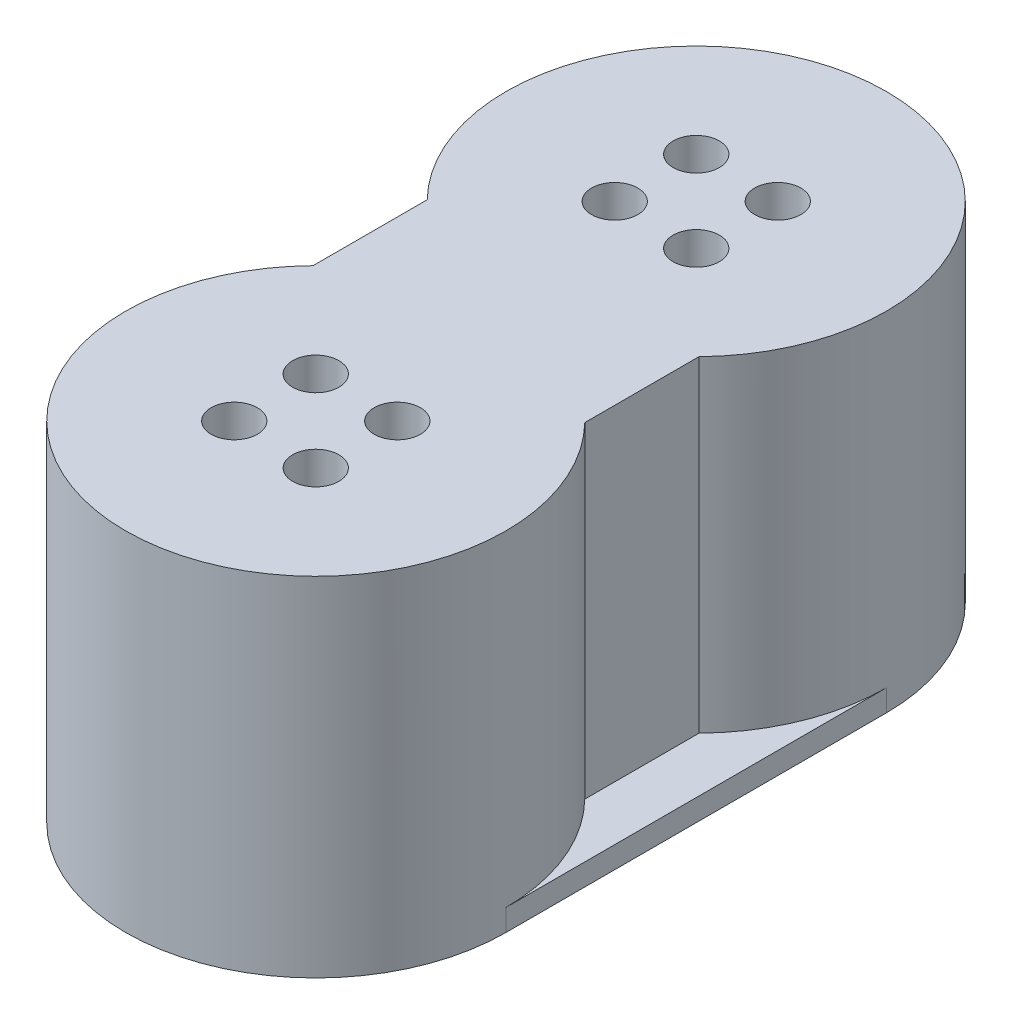
ISO-10303-21;
HEADER;
FILE_DESCRIPTION(('STEP AP214'),'2;1');
FILE_NAME('part.step','',(''),(''),'','','');
FILE_SCHEMA(('AUTOMOTIVE_DESIGN { 1 0 10303 214 1 1 1 1 }'));
ENDSEC;
DATA;
#1=APPLICATION_CONTEXT('core data for automotive mechanical design processes');
#2=APPLICATION_PROTOCOL_DEFINITION('international standard','automotive_design',2000,#1);
#3=PRODUCT_CONTEXT('',#1,'mechanical');
#4=PRODUCT('Part','Part','',(#3));
#5=PRODUCT_RELATED_PRODUCT_CATEGORY('part','',(#4));
#6=PRODUCT_DEFINITION_FORMATION('','',#4);
#7=PRODUCT_DEFINITION_CONTEXT('part definition',#1,'design');
#8=PRODUCT_DEFINITION('design','',#6,#7);
#9=PRODUCT_DEFINITION_SHAPE('','',#8);
#10=(LENGTH_UNIT() NAMED_UNIT(*) SI_UNIT(.MILLI.,.METRE.));
#11=(NAMED_UNIT(*) PLANE_ANGLE_UNIT() SI_UNIT($,.RADIAN.));
#12=(NAMED_UNIT(*) SI_UNIT($,.STERADIAN.) SOLID_ANGLE_UNIT());
#13=UNCERTAINTY_MEASURE_WITH_UNIT(LENGTH_MEASURE(1.E-05),#10,'distance_accuracy_value','');
#14=(GEOMETRIC_REPRESENTATION_CONTEXT(3) GLOBAL_UNCERTAINTY_ASSIGNED_CONTEXT((#13)) GLOBAL_UNIT_ASSIGNED_CONTEXT((#10,
#11,#12)) REPRESENTATION_CONTEXT('',''));
#15=CARTESIAN_POINT('',(0.,0.,0.));
#16=DIRECTION('',(0.,0.,1.));
#17=DIRECTION('',(1.,0.,0.));
#18=AXIS2_PLACEMENT_3D('',#15,#16,#17);
#19=CARTESIAN_POINT('',(0.,0.8,7.41363636363636));
#20=DIRECTION('',(0.,1.,0.));
#21=DIRECTION('',(0.,0.,1.));
#22=AXIS2_PLACEMENT_3D('',#19,#20,#21);
#23=PLANE('',#22);
#24=CARTESIAN_POINT('',(0.,0.8,7.41363636363636));
#25=DIRECTION('',(0.,1.,0.));
#26=DIRECTION('',(0.,0.,1.));
#27=AXIS2_PLACEMENT_3D('',#24,#25,#26);
#28=CIRCLE('',#27,7.);
#29=CARTESIAN_POINT('',(-5.,0.8,2.51465687807001));
#30=VERTEX_POINT('',#29);
#31=CARTESIAN_POINT('',(-7.,0.8,7.41363636363637));
#32=VERTEX_POINT('',#31);
#33=EDGE_CURVE('E50',#30,#32,#28,.T.);
#34=ORIENTED_EDGE('',*,*,#33,.F.);
#35=DIRECTION('',(0.,0.,1.));
#36=VECTOR('',#35,1.);
#37=CARTESIAN_POINT('',(-5.,0.8,2.51465687807001));
#38=LINE('',#37,#36);
#39=CARTESIAN_POINT('',(-5.,0.8,-1.68738415079728));
#40=VERTEX_POINT('',#39);
#41=EDGE_CURVE('E54',#40,#30,#38,.T.);
#42=ORIENTED_EDGE('',*,*,#41,.F.);
#43=CARTESIAN_POINT('',(0.,0.8,-6.58636363636364));
#44=DIRECTION('',(0.,1.,0.));
#45=DIRECTION('',(0.,0.,1.));
#46=AXIS2_PLACEMENT_3D('',#43,#44,#45);
#47=CIRCLE('',#46,7.);
#48=CARTESIAN_POINT('',(-7.,0.8,-6.58636363636364));
#49=VERTEX_POINT('',#48);
#50=EDGE_CURVE('E11',#49,#40,#47,.T.);
#51=ORIENTED_EDGE('',*,*,#50,.F.);
#52=DIRECTION('',(0.,0.,1.));
#53=VECTOR('',#52,1.);
#54=CARTESIAN_POINT('',(-7.,0.8,-6.58636363636363));
#55=LINE('',#54,#53);
#56=EDGE_CURVE('E153',#49,#32,#55,.T.);
#57=ORIENTED_EDGE('',*,*,#56,.T.);
#58=EDGE_LOOP('',(#34,#42,#51,#57));
#59=FACE_BOUND('',#58,.T.);
#60=ADVANCED_FACE('F32',(#59),#23,.T.);
#61=CARTESIAN_POINT('',(7.,0.8,-6.58636363636364));
#62=DIRECTION('',(1.,0.,0.));
#63=DIRECTION('',(0.,0.,-1.));
#64=AXIS2_PLACEMENT_3D('',#61,#62,#63);
#65=PLANE('',#64);
#66=DIRECTION('',(0.,0.,1.));
#67=VECTOR('',#66,1.);
#68=CARTESIAN_POINT('',(7.,0.,-6.58636363636364));
#69=LINE('',#68,#67);
#70=CARTESIAN_POINT('',(7.,0.,-6.58636363636364));
#71=VERTEX_POINT('',#70);
#72=CARTESIAN_POINT('',(7.,0.,7.41363636363636));
#73=VERTEX_POINT('',#72);
#74=EDGE_CURVE('E108',#71,#73,#69,.T.);
#75=ORIENTED_EDGE('',*,*,#74,.F.);
#76=DIRECTION('',(0.,-1.,0.));
#77=VECTOR('',#76,1.);
#78=CARTESIAN_POINT('',(7.,0.8,-6.58636363636364));
#79=LINE('',#78,#77);
#80=CARTESIAN_POINT('',(7.,0.8,-6.58636363636364));
#81=VERTEX_POINT('',#80);
#82=EDGE_CURVE('E164',#81,#71,#79,.T.);
#83=ORIENTED_EDGE('',*,*,#82,.F.);
#84=DIRECTION('',(0.,0.,1.));
#85=VECTOR('',#84,1.);
#86=CARTESIAN_POINT('',(7.,0.8,-6.58636363636364));
#87=LINE('',#86,#85);
#88=CARTESIAN_POINT('',(7.,0.8,7.41363636363636));
#89=VERTEX_POINT('',#88);
#90=EDGE_CURVE('E150',#81,#89,#87,.T.);
#91=ORIENTED_EDGE('',*,*,#90,.T.);
#92=DIRECTION('',(0.,-1.,0.));
#93=VECTOR('',#92,1.);
#94=CARTESIAN_POINT('',(7.,0.8,7.41363636363636));
#95=LINE('',#94,#93);
#96=EDGE_CURVE('E156',#89,#73,#95,.T.);
#97=ORIENTED_EDGE('',*,*,#96,.T.);
#98=EDGE_LOOP('',(#75,#83,#91,#97));
#99=FACE_BOUND('',#98,.T.);
#100=ADVANCED_FACE('F34',(#99),#65,.T.);
#101=CARTESIAN_POINT('',(0.,0.8,-6.58636363636364));
#102=DIRECTION('',(0.,-1.,0.));
#103=DIRECTION('',(0.,0.,-1.));
#104=AXIS2_PLACEMENT_3D('',#101,#102,#103);
#105=CYLINDRICAL_SURFACE('',#104,7.);
#106=CARTESIAN_POINT('',(0.,0.,-6.58636363636364));
#107=DIRECTION('',(0.,1.,0.));
#108=DIRECTION('',(0.,0.,1.));
#109=AXIS2_PLACEMENT_3D('',#106,#107,#108);
#110=CIRCLE('',#109,7.);
#111=CARTESIAN_POINT('',(-7.,0.,-6.58636363636364));
#112=VERTEX_POINT('',#111);
#113=EDGE_CURVE('E154',#71,#112,#110,.T.);
#114=ORIENTED_EDGE('',*,*,#113,.T.);
#115=DIRECTION('',(0.,-1.,0.));
#116=VECTOR('',#115,1.);
#117=CARTESIAN_POINT('',(-7.,0.8,-6.58636363636364));
#118=LINE('',#117,#116);
#119=EDGE_CURVE('E166',#49,#112,#118,.T.);
#120=ORIENTED_EDGE('',*,*,#119,.F.);
#121=ORIENTED_EDGE('',*,*,#50,.T.);
#122=DIRECTION('',(0.,-1.,0.));
#123=VECTOR('',#122,1.);
#124=CARTESIAN_POINT('',(-5.,4.8,-1.68738415079728));
#125=LINE('',#124,#123);
#126=CARTESIAN_POINT('',(-5.00000000000001,12.8,-1.68738415079728));
#127=VERTEX_POINT('',#126);
#128=EDGE_CURVE('E146',#127,#40,#125,.T.);
#129=ORIENTED_EDGE('',*,*,#128,.F.);
#130=CARTESIAN_POINT('',(0.,12.8,-6.58636363636364));
#131=DIRECTION('',(0.,1.,0.));
#132=DIRECTION('',(0.,0.,1.));
#133=AXIS2_PLACEMENT_3D('',#130,#131,#132);
#134=CIRCLE('',#133,7.);
#135=CARTESIAN_POINT('',(5.,12.8,-1.68738415079728));
#136=VERTEX_POINT('',#135);
#137=EDGE_CURVE('E118',#136,#127,#134,.T.);
#138=ORIENTED_EDGE('',*,*,#137,.F.);
#139=DIRECTION('',(0.,-1.,0.));
#140=VECTOR('',#139,1.);
#141=CARTESIAN_POINT('',(5.,4.8,-1.68738415079728));
#142=LINE('',#141,#140);
#143=CARTESIAN_POINT('',(5.,0.8,-1.68738415079728));
#144=VERTEX_POINT('',#143);
#145=EDGE_CURVE('E109',#136,#144,#142,.T.);
#146=ORIENTED_EDGE('',*,*,#145,.T.);
#147=EDGE_CURVE('E43',#144,#81,#47,.T.);
#148=ORIENTED_EDGE('',*,*,#147,.T.);
#149=ORIENTED_EDGE('',*,*,#82,.T.);
#150=EDGE_LOOP('',(#114,#120,#121,#129,#138,#146,#148,#149));
#151=FACE_BOUND('',#150,.T.);
#152=ADVANCED_FACE('F230',(#151),#105,.T.);
#153=CARTESIAN_POINT('',(-7.,0.8,-6.58636363636363));
#154=DIRECTION('',(1.,0.,0.));
#155=DIRECTION('',(0.,0.,-1.));
#156=AXIS2_PLACEMENT_3D('',#153,#154,#155);
#157=PLANE('',#156);
#158=DIRECTION('',(0.,0.,1.));
#159=VECTOR('',#158,1.);
#160=CARTESIAN_POINT('',(-7.,0.,-6.58636363636363));
#161=LINE('',#160,#159);
#162=CARTESIAN_POINT('',(-7.,0.,7.41363636363637));
#163=VERTEX_POINT('',#162);
#164=EDGE_CURVE('E161',#112,#163,#161,.T.);
#165=ORIENTED_EDGE('',*,*,#164,.T.);
#166=DIRECTION('',(0.,-1.,0.));
#167=VECTOR('',#166,1.);
#168=CARTESIAN_POINT('',(-7.,0.8,7.41363636363637));
#169=LINE('',#168,#167);
#170=EDGE_CURVE('E169',#32,#163,#169,.T.);
#171=ORIENTED_EDGE('',*,*,#170,.F.);
#172=ORIENTED_EDGE('',*,*,#56,.F.);
#173=ORIENTED_EDGE('',*,*,#119,.T.);
#174=EDGE_LOOP('',(#165,#171,#172,#173));
#175=FACE_BOUND('',#174,.T.);
#176=ADVANCED_FACE('F227',(#175),#157,.F.);
#177=CARTESIAN_POINT('',(0.,0.8,7.41363636363636));
#178=DIRECTION('',(0.,-1.,0.));
#179=DIRECTION('',(0.,0.,-1.));
#180=AXIS2_PLACEMENT_3D('',#177,#178,#179);
#181=CYLINDRICAL_SURFACE('',#180,7.);
#182=CARTESIAN_POINT('',(0.,0.,7.41363636363636));
#183=DIRECTION('',(0.,1.,0.));
#184=DIRECTION('',(0.,0.,1.));
#185=AXIS2_PLACEMENT_3D('',#182,#183,#184);
#186=CIRCLE('',#185,7.);
#187=EDGE_CURVE('E159',#163,#73,#186,.T.);
#188=ORIENTED_EDGE('',*,*,#187,.T.);
#189=ORIENTED_EDGE('',*,*,#96,.F.);
#190=CARTESIAN_POINT('',(5.,0.8,2.51465687807001));
#191=VERTEX_POINT('',#190);
#192=EDGE_CURVE('E41',#89,#191,#28,.T.);
#193=ORIENTED_EDGE('',*,*,#192,.T.);
#194=DIRECTION('',(0.,-1.,0.));
#195=VECTOR('',#194,1.);
#196=CARTESIAN_POINT('',(5.,4.8,2.51465687807001));
#197=LINE('',#196,#195);
#198=CARTESIAN_POINT('',(5.,12.8,2.51465687807));
#199=VERTEX_POINT('',#198);
#200=EDGE_CURVE('E98',#199,#191,#197,.T.);
#201=ORIENTED_EDGE('',*,*,#200,.F.);
#202=CARTESIAN_POINT('',(0.,12.8,7.41363636363636));
#203=DIRECTION('',(0.,1.,0.));
#204=DIRECTION('',(0.,0.,1.));
#205=AXIS2_PLACEMENT_3D('',#202,#203,#204);
#206=CIRCLE('',#205,7.);
#207=CARTESIAN_POINT('',(-5.,12.8,2.51465687807001));
#208=VERTEX_POINT('',#207);
#209=EDGE_CURVE('E104',#208,#199,#206,.T.);
#210=ORIENTED_EDGE('',*,*,#209,.F.);
#211=DIRECTION('',(0.,-1.,0.));
#212=VECTOR('',#211,1.);
#213=CARTESIAN_POINT('',(-5.,4.8,2.51465687807001));
#214=LINE('',#213,#212);
#215=EDGE_CURVE('E144',#208,#30,#214,.T.);
#216=ORIENTED_EDGE('',*,*,#215,.T.);
#217=ORIENTED_EDGE('',*,*,#33,.T.);
#218=ORIENTED_EDGE('',*,*,#170,.T.);
#219=EDGE_LOOP('',(#188,#189,#193,#201,#210,#216,#217,#218));
#220=FACE_BOUND('',#219,.T.);
#221=ADVANCED_FACE('F101',(#220),#181,.T.);
#222=ORIENTED_EDGE('',*,*,#192,.F.);
#223=ORIENTED_EDGE('',*,*,#90,.F.);
#224=ORIENTED_EDGE('',*,*,#147,.F.);
#225=DIRECTION('',(0.,0.,-1.));
#226=VECTOR('',#225,1.);
#227=CARTESIAN_POINT('',(5.,0.8,2.51465687807001));
#228=LINE('',#227,#226);
#229=EDGE_CURVE('E140',#191,#144,#228,.T.);
#230=ORIENTED_EDGE('',*,*,#229,.F.);
#231=EDGE_LOOP('',(#222,#223,#224,#230));
#232=FACE_BOUND('',#231,.T.);
#233=ADVANCED_FACE('F214',(#232),#23,.T.);
#234=CARTESIAN_POINT('',(0.,0.,7.41363636363636));
#235=DIRECTION('',(0.,1.,0.));
#236=DIRECTION('',(0.,0.,1.));
#237=AXIS2_PLACEMENT_3D('',#234,#235,#236);
#238=PLANE('',#237);
#239=CARTESIAN_POINT('',(0.,0.,-6.58636363636364));
#240=DIRECTION('',(0.,-1.,0.));
#241=DIRECTION('',(0.,0.,-1.));
#242=AXIS2_PLACEMENT_3D('',#239,#240,#241);
#243=CIRCLE('',#242,6.4);
#244=CARTESIAN_POINT('',(0.,0.,-12.9863636363636));
#245=VERTEX_POINT('',#244);
#246=EDGE_CURVE('E127',#245,#245,#243,.T.);
#247=ORIENTED_EDGE('',*,*,#246,.F.);
#248=EDGE_LOOP('',(#247));
#249=FACE_BOUND('',#248,.T.);
#250=CARTESIAN_POINT('',(0.,0.,7.41363636363636));
#251=DIRECTION('',(0.,-1.,0.));
#252=DIRECTION('',(0.,0.,-1.));
#253=AXIS2_PLACEMENT_3D('',#250,#251,#252);
#254=CIRCLE('',#253,6.4);
#255=CARTESIAN_POINT('',(0.,0.,1.01363636363637));
#256=VERTEX_POINT('',#255);
#257=EDGE_CURVE('E124',#256,#256,#254,.T.);
#258=ORIENTED_EDGE('',*,*,#257,.F.);
#259=EDGE_LOOP('',(#258));
#260=FACE_BOUND('',#259,.T.);
#261=ORIENTED_EDGE('',*,*,#74,.T.);
#262=ORIENTED_EDGE('',*,*,#187,.F.);
#263=ORIENTED_EDGE('',*,*,#164,.F.);
#264=ORIENTED_EDGE('',*,*,#113,.F.);
#265=EDGE_LOOP('',(#261,#262,#263,#264));
#266=FACE_BOUND('',#265,.T.);
#267=ADVANCED_FACE('F211',(#249,#260,#266),#238,.F.);
#268=CARTESIAN_POINT('',(5.,4.8,2.51465687807001));
#269=DIRECTION('',(-1.,0.,0.));
#270=DIRECTION('',(0.,0.,1.));
#271=AXIS2_PLACEMENT_3D('',#268,#269,#270);
#272=PLANE('',#271);
#273=ORIENTED_EDGE('',*,*,#229,.T.);
#274=ORIENTED_EDGE('',*,*,#145,.F.);
#275=DIRECTION('',(0.,0.,-1.));
#276=VECTOR('',#275,1.);
#277=CARTESIAN_POINT('',(5.,12.8,2.51465687807));
#278=LINE('',#277,#276);
#279=EDGE_CURVE('E112',#199,#136,#278,.T.);
#280=ORIENTED_EDGE('',*,*,#279,.F.);
#281=ORIENTED_EDGE('',*,*,#200,.T.);
#282=EDGE_LOOP('',(#273,#274,#280,#281));
#283=FACE_BOUND('',#282,.T.);
#284=ADVANCED_FACE('F113',(#283),#272,.F.);
#285=CARTESIAN_POINT('',(-5.,4.8,2.51465687807001));
#286=DIRECTION('',(1.,0.,0.));
#287=DIRECTION('',(0.,0.,-1.));
#288=AXIS2_PLACEMENT_3D('',#285,#286,#287);
#289=PLANE('',#288);
#290=ORIENTED_EDGE('',*,*,#41,.T.);
#291=ORIENTED_EDGE('',*,*,#215,.F.);
#292=DIRECTION('',(0.,0.,1.));
#293=VECTOR('',#292,1.);
#294=CARTESIAN_POINT('',(-5.00000000000001,12.8,-1.68738415079728));
#295=LINE('',#294,#293);
#296=EDGE_CURVE('E123',#127,#208,#295,.T.);
#297=ORIENTED_EDGE('',*,*,#296,.F.);
#298=ORIENTED_EDGE('',*,*,#128,.T.);
#299=EDGE_LOOP('',(#290,#291,#297,#298));
#300=FACE_BOUND('',#299,.T.);
#301=ADVANCED_FACE('F268',(#300),#289,.F.);
#302=CARTESIAN_POINT('',(0.,12.8,7.41363636363636));
#303=DIRECTION('',(0.,1.,0.));
#304=DIRECTION('',(0.,0.,1.));
#305=AXIS2_PLACEMENT_3D('',#302,#303,#304);
#306=PLANE('',#305);
#307=CARTESIAN_POINT('',(1.5,12.8,-8.08636363636363));
#308=DIRECTION('',(0.,1.,0.));
#309=DIRECTION('',(0.,0.,-1.));
#310=AXIS2_PLACEMENT_3D('',#307,#308,#309);
#311=CIRCLE('',#310,0.85);
#312=CARTESIAN_POINT('',(1.5,12.8,-8.93636363636363));
#313=VERTEX_POINT('',#312);
#314=EDGE_CURVE('E181',#313,#313,#311,.T.);
#315=ORIENTED_EDGE('',*,*,#314,.F.);
#316=EDGE_LOOP('',(#315));
#317=FACE_BOUND('',#316,.T.);
#318=CARTESIAN_POINT('',(1.5,12.8,-5.08636363636364));
#319=DIRECTION('',(0.,1.,0.));
#320=DIRECTION('',(0.,0.,1.));
#321=AXIS2_PLACEMENT_3D('',#318,#319,#320);
#322=CIRCLE('',#321,0.85);
#323=CARTESIAN_POINT('',(1.5,12.8,-4.23636363636364));
#324=VERTEX_POINT('',#323);
#325=EDGE_CURVE('E426',#324,#324,#322,.T.);
#326=ORIENTED_EDGE('',*,*,#325,.F.);
#327=EDGE_LOOP('',(#326));
#328=FACE_BOUND('',#327,.T.);
#329=CARTESIAN_POINT('',(-1.5,12.8,-5.08636363636364));
#330=DIRECTION('',(0.,1.,0.));
#331=DIRECTION('',(0.,0.,-1.));
#332=AXIS2_PLACEMENT_3D('',#329,#330,#331);
#333=CIRCLE('',#332,0.85);
#334=CARTESIAN_POINT('',(-1.5,12.8,-5.93636363636364));
#335=VERTEX_POINT('',#334);
#336=EDGE_CURVE('E422',#335,#335,#333,.T.);
#337=ORIENTED_EDGE('',*,*,#336,.F.);
#338=EDGE_LOOP('',(#337));
#339=FACE_BOUND('',#338,.T.);
#340=CARTESIAN_POINT('',(1.5,12.8,5.91363636363636));
#341=DIRECTION('',(0.,1.,0.));
#342=DIRECTION('',(0.,0.,-1.));
#343=AXIS2_PLACEMENT_3D('',#340,#341,#342);
#344=CIRCLE('',#343,0.85);
#345=CARTESIAN_POINT('',(1.5,12.8,5.06363636363636));
#346=VERTEX_POINT('',#345);
#347=EDGE_CURVE('E420',#346,#346,#344,.T.);
#348=ORIENTED_EDGE('',*,*,#347,.F.);
#349=EDGE_LOOP('',(#348));
#350=FACE_BOUND('',#349,.T.);
#351=CARTESIAN_POINT('',(1.5,12.8,8.91363636363636));
#352=DIRECTION('',(0.,1.,0.));
#353=DIRECTION('',(0.,0.,1.));
#354=AXIS2_PLACEMENT_3D('',#351,#352,#353);
#355=CIRCLE('',#354,0.85);
#356=CARTESIAN_POINT('',(1.5,12.8,9.76363636363636));
#357=VERTEX_POINT('',#356);
#358=EDGE_CURVE('E423',#357,#357,#355,.T.);
#359=ORIENTED_EDGE('',*,*,#358,.F.);
#360=EDGE_LOOP('',(#359));
#361=FACE_BOUND('',#360,.T.);
#362=CARTESIAN_POINT('',(-1.5,12.8,5.91363636363636));
#363=DIRECTION('',(0.,1.,0.));
#364=DIRECTION('',(0.,0.,1.));
#365=AXIS2_PLACEMENT_3D('',#362,#363,#364);
#366=CIRCLE('',#365,0.85);
#367=CARTESIAN_POINT('',(-1.5,12.8,6.76363636363636));
#368=VERTEX_POINT('',#367);
#369=EDGE_CURVE('E429',#368,#368,#366,.T.);
#370=ORIENTED_EDGE('',*,*,#369,.F.);
#371=EDGE_LOOP('',(#370));
#372=FACE_BOUND('',#371,.T.);
#373=CARTESIAN_POINT('',(-1.5,12.8,8.91363636363636));
#374=DIRECTION('',(0.,1.,0.));
#375=DIRECTION('',(0.,0.,-1.));
#376=AXIS2_PLACEMENT_3D('',#373,#374,#375);
#377=CIRCLE('',#376,0.85);
#378=CARTESIAN_POINT('',(-1.5,12.8,8.06363636363636));
#379=VERTEX_POINT('',#378);
#380=EDGE_CURVE('E204',#379,#379,#377,.T.);
#381=ORIENTED_EDGE('',*,*,#380,.F.);
#382=EDGE_LOOP('',(#381));
#383=FACE_BOUND('',#382,.T.);
#384=CARTESIAN_POINT('',(-1.5,12.8,-8.08636363636363));
#385=DIRECTION('',(0.,1.,0.));
#386=DIRECTION('',(0.,0.,1.));
#387=AXIS2_PLACEMENT_3D('',#384,#385,#386);
#388=CIRCLE('',#387,0.85);
#389=CARTESIAN_POINT('',(-1.5,12.8,-7.23636363636363));
#390=VERTEX_POINT('',#389);
#391=EDGE_CURVE('E176',#390,#390,#388,.T.);
#392=ORIENTED_EDGE('',*,*,#391,.F.);
#393=EDGE_LOOP('',(#392));
#394=FACE_BOUND('',#393,.T.);
#395=ORIENTED_EDGE('',*,*,#209,.T.);
#396=ORIENTED_EDGE('',*,*,#279,.T.);
#397=ORIENTED_EDGE('',*,*,#137,.T.);
#398=ORIENTED_EDGE('',*,*,#296,.T.);
#399=EDGE_LOOP('',(#395,#396,#397,#398));
#400=FACE_BOUND('',#399,.T.);
#401=ADVANCED_FACE('F121',(#317,#328,#339,#350,#361,#372,#383,#394,#400),#306,.T.);
#402=CARTESIAN_POINT('',(0.,4.8,7.41363636363636));
#403=DIRECTION('',(0.,-1.,0.));
#404=DIRECTION('',(0.,0.,-1.));
#405=AXIS2_PLACEMENT_3D('',#402,#403,#404);
#406=CYLINDRICAL_SURFACE('',#405,6.4);
#407=CARTESIAN_POINT('',(0.,4.8,7.41363636363636));
#408=DIRECTION('',(0.,1.,0.));
#409=DIRECTION('',(0.,0.,1.));
#410=AXIS2_PLACEMENT_3D('',#407,#408,#409);
#411=CIRCLE('',#410,6.4);
#412=CARTESIAN_POINT('',(0.,4.8,13.8136363636364));
#413=VERTEX_POINT('',#412);
#414=EDGE_CURVE('E133',#413,#413,#411,.T.);
#415=ORIENTED_EDGE('',*,*,#414,.T.);
#416=EDGE_LOOP('',(#415));
#417=FACE_BOUND('',#416,.T.);
#418=ORIENTED_EDGE('',*,*,#257,.T.);
#419=EDGE_LOOP('',(#418));
#420=FACE_BOUND('',#419,.T.);
#421=ADVANCED_FACE('F293',(#417,#420),#406,.F.);
#422=CARTESIAN_POINT('',(0.,4.8,7.41363636363636));
#423=DIRECTION('',(0.,1.,0.));
#424=DIRECTION('',(0.,0.,1.));
#425=AXIS2_PLACEMENT_3D('',#422,#423,#424);
#426=PLANE('',#425);
#427=CARTESIAN_POINT('',(1.5,4.8,5.91363636363636));
#428=DIRECTION('',(0.,1.,0.));
#429=DIRECTION('',(0.,0.,1.));
#430=AXIS2_PLACEMENT_3D('',#427,#428,#429);
#431=CIRCLE('',#430,0.85);
#432=CARTESIAN_POINT('',(1.5,4.8,6.76363636363636));
#433=VERTEX_POINT('',#432);
#434=EDGE_CURVE('E36',#433,#433,#431,.T.);
#435=ORIENTED_EDGE('',*,*,#434,.T.);
#436=EDGE_LOOP('',(#435));
#437=FACE_BOUND('',#436,.T.);
#438=CARTESIAN_POINT('',(1.5,4.8,8.91363636363636));
#439=DIRECTION('',(0.,1.,0.));
#440=DIRECTION('',(0.,0.,1.));
#441=AXIS2_PLACEMENT_3D('',#438,#439,#440);
#442=CIRCLE('',#441,0.85);
#443=CARTESIAN_POINT('',(1.5,4.8,9.76363636363636));
#444=VERTEX_POINT('',#443);
#445=EDGE_CURVE('E192',#444,#444,#442,.T.);
#446=ORIENTED_EDGE('',*,*,#445,.T.);
#447=EDGE_LOOP('',(#446));
#448=FACE_BOUND('',#447,.T.);
#449=CARTESIAN_POINT('',(-1.5,4.8,5.91363636363636));
#450=DIRECTION('',(0.,1.,0.));
#451=DIRECTION('',(0.,0.,1.));
#452=AXIS2_PLACEMENT_3D('',#449,#450,#451);
#453=CIRCLE('',#452,0.85);
#454=CARTESIAN_POINT('',(-1.5,4.8,6.76363636363636));
#455=VERTEX_POINT('',#454);
#456=EDGE_CURVE('E190',#455,#455,#453,.T.);
#457=ORIENTED_EDGE('',*,*,#456,.T.);
#458=EDGE_LOOP('',(#457));
#459=FACE_BOUND('',#458,.T.);
#460=CARTESIAN_POINT('',(-1.5,4.8,8.91363636363636));
#461=DIRECTION('',(0.,1.,0.));
#462=DIRECTION('',(0.,0.,1.));
#463=AXIS2_PLACEMENT_3D('',#460,#461,#462);
#464=CIRCLE('',#463,0.85);
#465=CARTESIAN_POINT('',(-1.5,4.8,9.76363636363636));
#466=VERTEX_POINT('',#465);
#467=EDGE_CURVE('E187',#466,#466,#464,.T.);
#468=ORIENTED_EDGE('',*,*,#467,.T.);
#469=EDGE_LOOP('',(#468));
#470=FACE_BOUND('',#469,.T.);
#471=ORIENTED_EDGE('',*,*,#414,.F.);
#472=EDGE_LOOP('',(#471));
#473=FACE_BOUND('',#472,.T.);
#474=ADVANCED_FACE('F298',(#437,#448,#459,#470,#473),#426,.F.);
#475=CARTESIAN_POINT('',(0.,4.8,-6.58636363636364));
#476=DIRECTION('',(0.,-1.,0.));
#477=DIRECTION('',(0.,0.,-1.));
#478=AXIS2_PLACEMENT_3D('',#475,#476,#477);
#479=CYLINDRICAL_SURFACE('',#478,6.4);
#480=CARTESIAN_POINT('',(0.,4.8,-6.58636363636364));
#481=DIRECTION('',(0.,1.,0.));
#482=DIRECTION('',(0.,0.,1.));
#483=AXIS2_PLACEMENT_3D('',#480,#481,#482);
#484=CIRCLE('',#483,6.4);
#485=CARTESIAN_POINT('',(0.,4.8,-0.186363636363635));
#486=VERTEX_POINT('',#485);
#487=EDGE_CURVE('E136',#486,#486,#484,.T.);
#488=ORIENTED_EDGE('',*,*,#487,.T.);
#489=EDGE_LOOP('',(#488));
#490=FACE_BOUND('',#489,.T.);
#491=ORIENTED_EDGE('',*,*,#246,.T.);
#492=EDGE_LOOP('',(#491));
#493=FACE_BOUND('',#492,.T.);
#494=ADVANCED_FACE('F209',(#490,#493),#479,.F.);
#495=CARTESIAN_POINT('',(1.5,4.8,-8.08636363636363));
#496=DIRECTION('',(0.,1.,0.));
#497=DIRECTION('',(0.,0.,1.));
#498=AXIS2_PLACEMENT_3D('',#495,#496,#497);
#499=CIRCLE('',#498,0.85);
#500=CARTESIAN_POINT('',(1.5,4.8,-7.23636363636363));
#501=VERTEX_POINT('',#500);
#502=EDGE_CURVE('E184',#501,#501,#499,.T.);
#503=ORIENTED_EDGE('',*,*,#502,.T.);
#504=EDGE_LOOP('',(#503));
#505=FACE_BOUND('',#504,.T.);
#506=CARTESIAN_POINT('',(1.5,4.8,-5.08636363636364));
#507=DIRECTION('',(0.,1.,0.));
#508=DIRECTION('',(0.,0.,1.));
#509=AXIS2_PLACEMENT_3D('',#506,#507,#508);
#510=CIRCLE('',#509,0.85);
#511=CARTESIAN_POINT('',(1.5,4.8,-4.23636363636364));
#512=VERTEX_POINT('',#511);
#513=EDGE_CURVE('E180',#512,#512,#510,.T.);
#514=ORIENTED_EDGE('',*,*,#513,.T.);
#515=EDGE_LOOP('',(#514));
#516=FACE_BOUND('',#515,.T.);
#517=CARTESIAN_POINT('',(-1.5,4.8,-5.08636363636364));
#518=DIRECTION('',(0.,1.,0.));
#519=DIRECTION('',(0.,0.,1.));
#520=AXIS2_PLACEMENT_3D('',#517,#518,#519);
#521=CIRCLE('',#520,0.85);
#522=CARTESIAN_POINT('',(-1.5,4.8,-4.23636363636364));
#523=VERTEX_POINT('',#522);
#524=EDGE_CURVE('E177',#523,#523,#521,.T.);
#525=ORIENTED_EDGE('',*,*,#524,.T.);
#526=EDGE_LOOP('',(#525));
#527=FACE_BOUND('',#526,.T.);
#528=CARTESIAN_POINT('',(-1.5,4.8,-8.08636363636363));
#529=DIRECTION('',(0.,1.,0.));
#530=DIRECTION('',(0.,0.,1.));
#531=AXIS2_PLACEMENT_3D('',#528,#529,#530);
#532=CIRCLE('',#531,0.85);
#533=CARTESIAN_POINT('',(-1.5,4.8,-7.23636363636363));
#534=VERTEX_POINT('',#533);
#535=EDGE_CURVE('E173',#534,#534,#532,.T.);
#536=ORIENTED_EDGE('',*,*,#535,.T.);
#537=EDGE_LOOP('',(#536));
#538=FACE_BOUND('',#537,.T.);
#539=ORIENTED_EDGE('',*,*,#487,.F.);
#540=EDGE_LOOP('',(#539));
#541=FACE_BOUND('',#540,.T.);
#542=ADVANCED_FACE('F311',(#505,#516,#527,#538,#541),#426,.F.);
#543=CARTESIAN_POINT('',(-1.5,0.,-8.08636363636363));
#544=DIRECTION('',(0.,1.,0.));
#545=DIRECTION('',(0.,0.,1.));
#546=AXIS2_PLACEMENT_3D('',#543,#544,#545);
#547=CYLINDRICAL_SURFACE('',#546,0.85);
#548=ORIENTED_EDGE('',*,*,#391,.T.);
#549=EDGE_LOOP('',(#548));
#550=FACE_BOUND('',#549,.T.);
#551=ORIENTED_EDGE('',*,*,#535,.F.);
#552=EDGE_LOOP('',(#551));
#553=FACE_BOUND('',#552,.T.);
#554=ADVANCED_FACE('F336',(#550,#553),#547,.F.);
#555=CARTESIAN_POINT('',(-1.5,0.,-5.08636363636364));
#556=DIRECTION('',(0.,1.,0.));
#557=DIRECTION('',(0.,0.,1.));
#558=AXIS2_PLACEMENT_3D('',#555,#556,#557);
#559=CYLINDRICAL_SURFACE('',#558,0.85);
#560=ORIENTED_EDGE('',*,*,#336,.T.);
#561=EDGE_LOOP('',(#560));
#562=FACE_BOUND('',#561,.T.);
#563=ORIENTED_EDGE('',*,*,#524,.F.);
#564=EDGE_LOOP('',(#563));
#565=FACE_BOUND('',#564,.T.);
#566=ADVANCED_FACE('F344',(#562,#565),#559,.F.);
#567=CARTESIAN_POINT('',(1.5,0.,-5.08636363636364));
#568=DIRECTION('',(0.,1.,0.));
#569=DIRECTION('',(0.,0.,1.));
#570=AXIS2_PLACEMENT_3D('',#567,#568,#569);
#571=CYLINDRICAL_SURFACE('',#570,0.85);
#572=ORIENTED_EDGE('',*,*,#325,.T.);
#573=EDGE_LOOP('',(#572));
#574=FACE_BOUND('',#573,.T.);
#575=ORIENTED_EDGE('',*,*,#513,.F.);
#576=EDGE_LOOP('',(#575));
#577=FACE_BOUND('',#576,.T.);
#578=ADVANCED_FACE('F353',(#574,#577),#571,.F.);
#579=CARTESIAN_POINT('',(1.5,0.,-8.08636363636363));
#580=DIRECTION('',(0.,1.,0.));
#581=DIRECTION('',(0.,0.,1.));
#582=AXIS2_PLACEMENT_3D('',#579,#580,#581);
#583=CYLINDRICAL_SURFACE('',#582,0.85);
#584=ORIENTED_EDGE('',*,*,#314,.T.);
#585=EDGE_LOOP('',(#584));
#586=FACE_BOUND('',#585,.T.);
#587=ORIENTED_EDGE('',*,*,#502,.F.);
#588=EDGE_LOOP('',(#587));
#589=FACE_BOUND('',#588,.T.);
#590=ADVANCED_FACE('F363',(#586,#589),#583,.F.);
#591=CARTESIAN_POINT('',(-1.5,0.,8.91363636363636));
#592=DIRECTION('',(0.,1.,0.));
#593=DIRECTION('',(0.,0.,1.));
#594=AXIS2_PLACEMENT_3D('',#591,#592,#593);
#595=CYLINDRICAL_SURFACE('',#594,0.85);
#596=ORIENTED_EDGE('',*,*,#380,.T.);
#597=EDGE_LOOP('',(#596));
#598=FACE_BOUND('',#597,.T.);
#599=ORIENTED_EDGE('',*,*,#467,.F.);
#600=EDGE_LOOP('',(#599));
#601=FACE_BOUND('',#600,.T.);
#602=ADVANCED_FACE('F373',(#598,#601),#595,.F.);
#603=CARTESIAN_POINT('',(-1.5,0.,5.91363636363636));
#604=DIRECTION('',(0.,1.,0.));
#605=DIRECTION('',(0.,0.,1.));
#606=AXIS2_PLACEMENT_3D('',#603,#604,#605);
#607=CYLINDRICAL_SURFACE('',#606,0.85);
#608=ORIENTED_EDGE('',*,*,#369,.T.);
#609=EDGE_LOOP('',(#608));
#610=FACE_BOUND('',#609,.T.);
#611=ORIENTED_EDGE('',*,*,#456,.F.);
#612=EDGE_LOOP('',(#611));
#613=FACE_BOUND('',#612,.T.);
#614=ADVANCED_FACE('F383',(#610,#613),#607,.F.);
#615=CARTESIAN_POINT('',(1.5,0.,8.91363636363636));
#616=DIRECTION('',(0.,1.,0.));
#617=DIRECTION('',(0.,0.,1.));
#618=AXIS2_PLACEMENT_3D('',#615,#616,#617);
#619=CYLINDRICAL_SURFACE('',#618,0.85);
#620=ORIENTED_EDGE('',*,*,#358,.T.);
#621=EDGE_LOOP('',(#620));
#622=FACE_BOUND('',#621,.T.);
#623=ORIENTED_EDGE('',*,*,#445,.F.);
#624=EDGE_LOOP('',(#623));
#625=FACE_BOUND('',#624,.T.);
#626=ADVANCED_FACE('F393',(#622,#625),#619,.F.);
#627=CARTESIAN_POINT('',(1.5,0.,5.91363636363636));
#628=DIRECTION('',(0.,1.,0.));
#629=DIRECTION('',(0.,0.,1.));
#630=AXIS2_PLACEMENT_3D('',#627,#628,#629);
#631=CYLINDRICAL_SURFACE('',#630,0.85);
#632=ORIENTED_EDGE('',*,*,#347,.T.);
#633=EDGE_LOOP('',(#632));
#634=FACE_BOUND('',#633,.T.);
#635=ORIENTED_EDGE('',*,*,#434,.F.);
#636=EDGE_LOOP('',(#635));
#637=FACE_BOUND('',#636,.T.);
#638=ADVANCED_FACE('F403',(#634,#637),#631,.F.);
#639=CLOSED_SHELL('',(#60,#100,#152,#176,#221,#233,#267,#284,#301,#401,#421,#474,#494,#542,#554,
#566,#578,#590,#602,#614,#626,#638));
#640=MANIFOLD_SOLID_BREP('B2',#639);
#641=ADVANCED_BREP_SHAPE_REPRESENTATION('',(#18,#640),#14);
#642=SHAPE_DEFINITION_REPRESENTATION(#9,#641);
ENDSEC;
END-ISO-10303-21;
